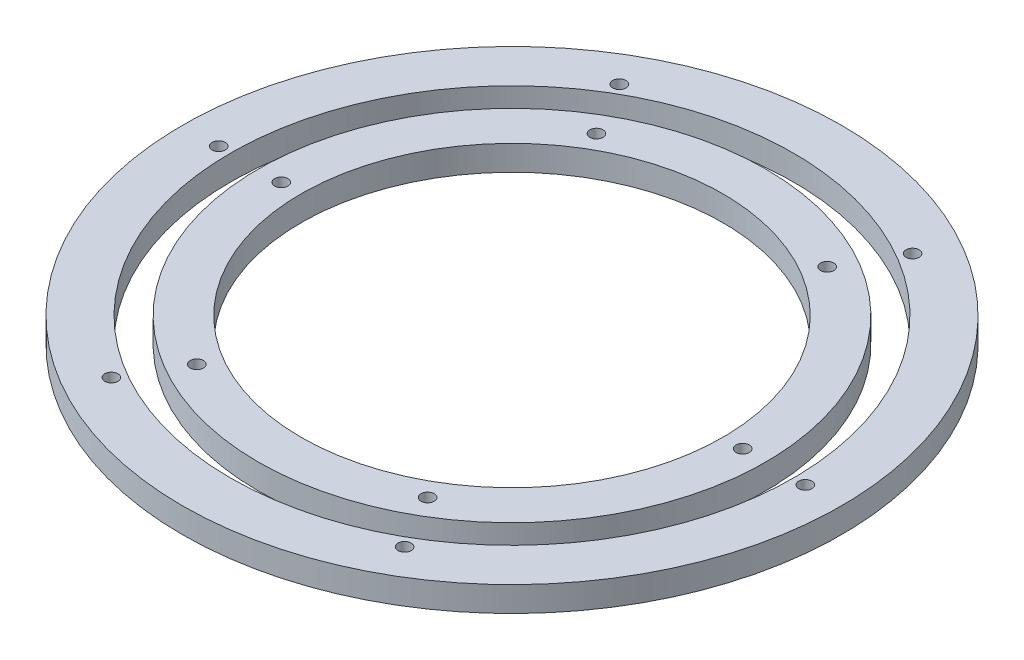
ISO-10303-21;
HEADER;
FILE_DESCRIPTION(('STEP AP214'),'2;1');
FILE_NAME('part.step','',(''),(''),'','','');
FILE_SCHEMA(('AUTOMOTIVE_DESIGN { 1 0 10303 214 1 1 1 1 }'));
ENDSEC;
DATA;
#1=APPLICATION_CONTEXT('core data for automotive mechanical design processes');
#2=APPLICATION_PROTOCOL_DEFINITION('international standard','automotive_design',2000,#1);
#3=PRODUCT_CONTEXT('',#1,'mechanical');
#4=PRODUCT('Part','Part','',(#3));
#5=PRODUCT_RELATED_PRODUCT_CATEGORY('part','',(#4));
#6=PRODUCT_DEFINITION_FORMATION('','',#4);
#7=PRODUCT_DEFINITION_CONTEXT('part definition',#1,'design');
#8=PRODUCT_DEFINITION('design','',#6,#7);
#9=PRODUCT_DEFINITION_SHAPE('','',#8);
#10=(LENGTH_UNIT() NAMED_UNIT(*) SI_UNIT(.MILLI.,.METRE.));
#11=(NAMED_UNIT(*) PLANE_ANGLE_UNIT() SI_UNIT($,.RADIAN.));
#12=(NAMED_UNIT(*) SI_UNIT($,.STERADIAN.) SOLID_ANGLE_UNIT());
#13=UNCERTAINTY_MEASURE_WITH_UNIT(LENGTH_MEASURE(1.E-05),#10,'distance_accuracy_value','');
#14=(GEOMETRIC_REPRESENTATION_CONTEXT(3) GLOBAL_UNCERTAINTY_ASSIGNED_CONTEXT((#13)) GLOBAL_UNIT_ASSIGNED_CONTEXT((#10,
#11,#12)) REPRESENTATION_CONTEXT('',''));
#15=CARTESIAN_POINT('',(0.,0.,0.));
#16=DIRECTION('',(0.,0.,1.));
#17=DIRECTION('',(1.,0.,0.));
#18=AXIS2_PLACEMENT_3D('',#15,#16,#17);
#19=CARTESIAN_POINT('',(0.,9.5,0.));
#20=DIRECTION('',(0.,1.,0.));
#21=DIRECTION('',(0.,0.,1.));
#22=AXIS2_PLACEMENT_3D('',#19,#20,#21);
#23=PLANE('',#22);
#24=CARTESIAN_POINT('',(-111.25,9.5,192.690652342038));
#25=DIRECTION('',(0.,1.,0.));
#26=DIRECTION('',(0.,0.,1.));
#27=AXIS2_PLACEMENT_3D('',#24,#25,#26);
#28=CIRCLE('',#27,4.99999999999988);
#29=CARTESIAN_POINT('',(-111.25,9.5,197.690652342037));
#30=VERTEX_POINT('',#29);
#31=EDGE_CURVE('E11',#30,#30,#28,.T.);
#32=ORIENTED_EDGE('',*,*,#31,.F.);
#33=EDGE_LOOP('',(#32));
#34=FACE_BOUND('',#33,.T.);
#35=CARTESIAN_POINT('',(111.25,9.5,192.690652342038));
#36=DIRECTION('',(0.,1.,0.));
#37=DIRECTION('',(0.,0.,-1.));
#38=AXIS2_PLACEMENT_3D('',#35,#36,#37);
#39=CIRCLE('',#38,5.00000000000039);
#40=CARTESIAN_POINT('',(111.25,9.5,187.690652342038));
#41=VERTEX_POINT('',#40);
#42=EDGE_CURVE('E54',#41,#41,#39,.T.);
#43=ORIENTED_EDGE('',*,*,#42,.F.);
#44=EDGE_LOOP('',(#43));
#45=FACE_BOUND('',#44,.T.);
#46=CARTESIAN_POINT('',(-111.25,9.5,-192.690652342038));
#47=DIRECTION('',(0.,1.,0.));
#48=DIRECTION('',(0.,0.,-1.));
#49=AXIS2_PLACEMENT_3D('',#46,#47,#48);
#50=CIRCLE('',#49,4.99999999999988);
#51=CARTESIAN_POINT('',(-111.25,9.5,-197.690652342037));
#52=VERTEX_POINT('',#51);
#53=EDGE_CURVE('E60',#52,#52,#50,.T.);
#54=ORIENTED_EDGE('',*,*,#53,.F.);
#55=EDGE_LOOP('',(#54));
#56=FACE_BOUND('',#55,.T.);
#57=CARTESIAN_POINT('',(-222.5,9.5,0.));
#58=DIRECTION('',(0.,1.,0.));
#59=DIRECTION('',(0.,0.,-1.));
#60=AXIS2_PLACEMENT_3D('',#57,#58,#59);
#61=CIRCLE('',#60,4.99999999999999);
#62=CARTESIAN_POINT('',(-222.5,9.5,-4.99999999999999));
#63=VERTEX_POINT('',#62);
#64=EDGE_CURVE('E79',#63,#63,#61,.T.);
#65=ORIENTED_EDGE('',*,*,#64,.F.);
#66=EDGE_LOOP('',(#65));
#67=FACE_BOUND('',#66,.T.);
#68=CARTESIAN_POINT('',(222.5,9.5,0.));
#69=DIRECTION('',(0.,1.,0.));
#70=DIRECTION('',(0.,0.,1.));
#71=AXIS2_PLACEMENT_3D('',#68,#69,#70);
#72=CIRCLE('',#71,4.99999999999999);
#73=CARTESIAN_POINT('',(222.5,9.5,4.99999999999999));
#74=VERTEX_POINT('',#73);
#75=EDGE_CURVE('E87',#74,#74,#72,.T.);
#76=ORIENTED_EDGE('',*,*,#75,.F.);
#77=EDGE_LOOP('',(#76));
#78=FACE_BOUND('',#77,.T.);
#79=CARTESIAN_POINT('',(111.249999999999,9.5,-192.690652342038));
#80=DIRECTION('',(0.,1.,0.));
#81=DIRECTION('',(0.,0.,1.));
#82=AXIS2_PLACEMENT_3D('',#79,#80,#81);
#83=CIRCLE('',#82,5.00000000000042);
#84=CARTESIAN_POINT('',(111.249999999999,9.5,-187.690652342038));
#85=VERTEX_POINT('',#84);
#86=EDGE_CURVE('E95',#85,#85,#83,.T.);
#87=ORIENTED_EDGE('',*,*,#86,.F.);
#88=EDGE_LOOP('',(#87));
#89=FACE_BOUND('',#88,.T.);
#90=CARTESIAN_POINT('',(0.,9.5,0.));
#91=DIRECTION('',(0.,1.,0.));
#92=DIRECTION('',(0.,0.,1.));
#93=AXIS2_PLACEMENT_3D('',#90,#91,#92);
#94=CIRCLE('',#93,213.5);
#95=CARTESIAN_POINT('',(0.,9.5,213.5));
#96=VERTEX_POINT('',#95);
#97=EDGE_CURVE('E100',#96,#96,#94,.T.);
#98=ORIENTED_EDGE('',*,*,#97,.F.);
#99=EDGE_LOOP('',(#98));
#100=FACE_BOUND('',#99,.T.);
#101=CARTESIAN_POINT('',(0.,9.5,0.));
#102=DIRECTION('',(0.,1.,0.));
#103=DIRECTION('',(0.,0.,1.));
#104=AXIS2_PLACEMENT_3D('',#101,#102,#103);
#105=CIRCLE('',#104,250.);
#106=CARTESIAN_POINT('',(0.,9.5,250.));
#107=VERTEX_POINT('',#106);
#108=EDGE_CURVE('E70',#107,#107,#105,.T.);
#109=ORIENTED_EDGE('',*,*,#108,.T.);
#110=EDGE_LOOP('',(#109));
#111=FACE_BOUND('',#110,.T.);
#112=ADVANCED_FACE('F45',(#34,#45,#56,#67,#78,#89,#100,#111),#23,.T.);
#113=CARTESIAN_POINT('',(0.,-9.5,0.));
#114=DIRECTION('',(0.,1.,0.));
#115=DIRECTION('',(0.,0.,1.));
#116=AXIS2_PLACEMENT_3D('',#113,#114,#115);
#117=PLANE('',#116);
#118=CARTESIAN_POINT('',(-111.25,-9.5,192.690652342038));
#119=DIRECTION('',(0.,1.,0.));
#120=DIRECTION('',(0.,0.,1.));
#121=AXIS2_PLACEMENT_3D('',#118,#119,#120);
#122=CIRCLE('',#121,4.99999999999988);
#123=CARTESIAN_POINT('',(-111.25,-9.5,197.690652342037));
#124=VERTEX_POINT('',#123);
#125=EDGE_CURVE('E66',#124,#124,#122,.T.);
#126=ORIENTED_EDGE('',*,*,#125,.T.);
#127=EDGE_LOOP('',(#126));
#128=FACE_BOUND('',#127,.T.);
#129=CARTESIAN_POINT('',(111.25,-9.5,192.690652342038));
#130=DIRECTION('',(0.,1.,0.));
#131=DIRECTION('',(0.,0.,-1.));
#132=AXIS2_PLACEMENT_3D('',#129,#130,#131);
#133=CIRCLE('',#132,5.00000000000039);
#134=CARTESIAN_POINT('',(111.25,-9.5,187.690652342038));
#135=VERTEX_POINT('',#134);
#136=EDGE_CURVE('E69',#135,#135,#133,.T.);
#137=ORIENTED_EDGE('',*,*,#136,.T.);
#138=EDGE_LOOP('',(#137));
#139=FACE_BOUND('',#138,.T.);
#140=CARTESIAN_POINT('',(-111.25,-9.5,-192.690652342038));
#141=DIRECTION('',(0.,1.,0.));
#142=DIRECTION('',(0.,0.,-1.));
#143=AXIS2_PLACEMENT_3D('',#140,#141,#142);
#144=CIRCLE('',#143,4.99999999999988);
#145=CARTESIAN_POINT('',(-111.25,-9.5,-197.690652342037));
#146=VERTEX_POINT('',#145);
#147=EDGE_CURVE('E75',#146,#146,#144,.T.);
#148=ORIENTED_EDGE('',*,*,#147,.T.);
#149=EDGE_LOOP('',(#148));
#150=FACE_BOUND('',#149,.T.);
#151=CARTESIAN_POINT('',(-222.5,-9.5,0.));
#152=DIRECTION('',(0.,1.,0.));
#153=DIRECTION('',(0.,0.,-1.));
#154=AXIS2_PLACEMENT_3D('',#151,#152,#153);
#155=CIRCLE('',#154,4.99999999999999);
#156=CARTESIAN_POINT('',(-222.5,-9.5,-4.99999999999999));
#157=VERTEX_POINT('',#156);
#158=EDGE_CURVE('E83',#157,#157,#155,.T.);
#159=ORIENTED_EDGE('',*,*,#158,.T.);
#160=EDGE_LOOP('',(#159));
#161=FACE_BOUND('',#160,.T.);
#162=CARTESIAN_POINT('',(222.5,-9.5,0.));
#163=DIRECTION('',(0.,1.,0.));
#164=DIRECTION('',(0.,0.,1.));
#165=AXIS2_PLACEMENT_3D('',#162,#163,#164);
#166=CIRCLE('',#165,4.99999999999999);
#167=CARTESIAN_POINT('',(222.5,-9.5,4.99999999999999));
#168=VERTEX_POINT('',#167);
#169=EDGE_CURVE('E91',#168,#168,#166,.T.);
#170=ORIENTED_EDGE('',*,*,#169,.T.);
#171=EDGE_LOOP('',(#170));
#172=FACE_BOUND('',#171,.T.);
#173=CARTESIAN_POINT('',(111.249999999999,-9.5,-192.690652342038));
#174=DIRECTION('',(0.,1.,0.));
#175=DIRECTION('',(0.,0.,1.));
#176=AXIS2_PLACEMENT_3D('',#173,#174,#175);
#177=CIRCLE('',#176,5.00000000000042);
#178=CARTESIAN_POINT('',(111.249999999999,-9.5,-187.690652342038));
#179=VERTEX_POINT('',#178);
#180=EDGE_CURVE('E49',#179,#179,#177,.T.);
#181=ORIENTED_EDGE('',*,*,#180,.T.);
#182=EDGE_LOOP('',(#181));
#183=FACE_BOUND('',#182,.T.);
#184=CARTESIAN_POINT('',(0.,-9.5,0.));
#185=DIRECTION('',(0.,1.,0.));
#186=DIRECTION('',(0.,0.,1.));
#187=AXIS2_PLACEMENT_3D('',#184,#185,#186);
#188=CIRCLE('',#187,213.5);
#189=CARTESIAN_POINT('',(0.,-9.5,213.5));
#190=VERTEX_POINT('',#189);
#191=EDGE_CURVE('E64',#190,#190,#188,.T.);
#192=ORIENTED_EDGE('',*,*,#191,.T.);
#193=EDGE_LOOP('',(#192));
#194=FACE_BOUND('',#193,.T.);
#195=CARTESIAN_POINT('',(0.,-9.5,0.));
#196=DIRECTION('',(0.,1.,0.));
#197=DIRECTION('',(0.,0.,1.));
#198=AXIS2_PLACEMENT_3D('',#195,#196,#197);
#199=CIRCLE('',#198,250.);
#200=CARTESIAN_POINT('',(0.,-9.5,250.));
#201=VERTEX_POINT('',#200);
#202=EDGE_CURVE('E105',#201,#201,#199,.T.);
#203=ORIENTED_EDGE('',*,*,#202,.F.);
#204=EDGE_LOOP('',(#203));
#205=FACE_BOUND('',#204,.T.);
#206=ADVANCED_FACE('F47',(#128,#139,#150,#161,#172,#183,#194,#205),#117,.F.);
#207=CARTESIAN_POINT('',(0.,9.5,0.));
#208=DIRECTION('',(0.,-1.,0.));
#209=DIRECTION('',(0.,0.,-1.));
#210=AXIS2_PLACEMENT_3D('',#207,#208,#209);
#211=CYLINDRICAL_SURFACE('',#210,250.);
#212=ORIENTED_EDGE('',*,*,#108,.F.);
#213=EDGE_LOOP('',(#212));
#214=FACE_BOUND('',#213,.T.);
#215=ORIENTED_EDGE('',*,*,#202,.T.);
#216=EDGE_LOOP('',(#215));
#217=FACE_BOUND('',#216,.T.);
#218=ADVANCED_FACE('F117',(#214,#217),#211,.T.);
#219=CARTESIAN_POINT('',(0.,-9.5,0.));
#220=DIRECTION('',(0.,1.,0.));
#221=DIRECTION('',(0.,0.,1.));
#222=AXIS2_PLACEMENT_3D('',#219,#220,#221);
#223=CYLINDRICAL_SURFACE('',#222,213.5);
#224=ORIENTED_EDGE('',*,*,#191,.F.);
#225=EDGE_LOOP('',(#224));
#226=FACE_BOUND('',#225,.T.);
#227=ORIENTED_EDGE('',*,*,#97,.T.);
#228=EDGE_LOOP('',(#227));
#229=FACE_BOUND('',#228,.T.);
#230=ADVANCED_FACE('F120',(#226,#229),#223,.F.);
#231=CARTESIAN_POINT('',(111.249999999999,-9.5,-192.690652342038));
#232=DIRECTION('',(0.,1.,0.));
#233=DIRECTION('',(0.,0.,1.));
#234=AXIS2_PLACEMENT_3D('',#231,#232,#233);
#235=CYLINDRICAL_SURFACE('',#234,5.00000000000042);
#236=ORIENTED_EDGE('',*,*,#180,.F.);
#237=EDGE_LOOP('',(#236));
#238=FACE_BOUND('',#237,.T.);
#239=ORIENTED_EDGE('',*,*,#86,.T.);
#240=EDGE_LOOP('',(#239));
#241=FACE_BOUND('',#240,.T.);
#242=ADVANCED_FACE('F149',(#238,#241),#235,.F.);
#243=CARTESIAN_POINT('',(222.5,-9.5,0.));
#244=DIRECTION('',(0.,1.,0.));
#245=DIRECTION('',(0.,0.,1.));
#246=AXIS2_PLACEMENT_3D('',#243,#244,#245);
#247=CYLINDRICAL_SURFACE('',#246,4.99999999999999);
#248=ORIENTED_EDGE('',*,*,#169,.F.);
#249=EDGE_LOOP('',(#248));
#250=FACE_BOUND('',#249,.T.);
#251=ORIENTED_EDGE('',*,*,#75,.T.);
#252=EDGE_LOOP('',(#251));
#253=FACE_BOUND('',#252,.T.);
#254=ADVANCED_FACE('F154',(#250,#253),#247,.F.);
#255=CARTESIAN_POINT('',(-222.5,-9.5,0.));
#256=DIRECTION('',(0.,1.,0.));
#257=DIRECTION('',(0.,0.,1.));
#258=AXIS2_PLACEMENT_3D('',#255,#256,#257);
#259=CYLINDRICAL_SURFACE('',#258,4.99999999999999);
#260=ORIENTED_EDGE('',*,*,#158,.F.);
#261=EDGE_LOOP('',(#260));
#262=FACE_BOUND('',#261,.T.);
#263=ORIENTED_EDGE('',*,*,#64,.T.);
#264=EDGE_LOOP('',(#263));
#265=FACE_BOUND('',#264,.T.);
#266=ADVANCED_FACE('F169',(#262,#265),#259,.F.);
#267=CARTESIAN_POINT('',(-111.25,-9.5,-192.690652342038));
#268=DIRECTION('',(0.,1.,0.));
#269=DIRECTION('',(0.,0.,1.));
#270=AXIS2_PLACEMENT_3D('',#267,#268,#269);
#271=CYLINDRICAL_SURFACE('',#270,4.99999999999988);
#272=ORIENTED_EDGE('',*,*,#147,.F.);
#273=EDGE_LOOP('',(#272));
#274=FACE_BOUND('',#273,.T.);
#275=ORIENTED_EDGE('',*,*,#53,.T.);
#276=EDGE_LOOP('',(#275));
#277=FACE_BOUND('',#276,.T.);
#278=ADVANCED_FACE('F165',(#274,#277),#271,.F.);
#279=CARTESIAN_POINT('',(111.25,-9.5,192.690652342038));
#280=DIRECTION('',(0.,1.,0.));
#281=DIRECTION('',(0.,0.,1.));
#282=AXIS2_PLACEMENT_3D('',#279,#280,#281);
#283=CYLINDRICAL_SURFACE('',#282,5.00000000000039);
#284=ORIENTED_EDGE('',*,*,#136,.F.);
#285=EDGE_LOOP('',(#284));
#286=FACE_BOUND('',#285,.T.);
#287=ORIENTED_EDGE('',*,*,#42,.T.);
#288=EDGE_LOOP('',(#287));
#289=FACE_BOUND('',#288,.T.);
#290=ADVANCED_FACE('F161',(#286,#289),#283,.F.);
#291=CARTESIAN_POINT('',(-111.25,-9.5,192.690652342038));
#292=DIRECTION('',(0.,1.,0.));
#293=DIRECTION('',(0.,0.,1.));
#294=AXIS2_PLACEMENT_3D('',#291,#292,#293);
#295=CYLINDRICAL_SURFACE('',#294,4.99999999999988);
#296=ORIENTED_EDGE('',*,*,#125,.F.);
#297=EDGE_LOOP('',(#296));
#298=FACE_BOUND('',#297,.T.);
#299=ORIENTED_EDGE('',*,*,#31,.T.);
#300=EDGE_LOOP('',(#299));
#301=FACE_BOUND('',#300,.T.);
#302=ADVANCED_FACE('F158',(#298,#301),#295,.F.);
#303=CLOSED_SHELL('',(#112,#206,#218,#230,#242,#254,#266,#278,#290,#302));
#304=MANIFOLD_SOLID_BREP('B2',#303);
#305=CARTESIAN_POINT('',(0.,9.5,0.));
#306=DIRECTION('',(0.,1.,0.));
#307=DIRECTION('',(0.,0.,1.));
#308=AXIS2_PLACEMENT_3D('',#305,#306,#307);
#309=PLANE('',#308);
#310=CARTESIAN_POINT('',(-87.5,9.5,-151.554445662277));
#311=DIRECTION('',(0.,1.,0.));
#312=DIRECTION('',(0.,0.,1.));
#313=AXIS2_PLACEMENT_3D('',#310,#311,#312);
#314=CIRCLE('',#313,5.00000000000001);
#315=CARTESIAN_POINT('',(-87.5,9.5,-146.554445662277));
#316=VERTEX_POINT('',#315);
#317=EDGE_CURVE('E298',#316,#316,#314,.T.);
#318=ORIENTED_EDGE('',*,*,#317,.F.);
#319=EDGE_LOOP('',(#318));
#320=FACE_BOUND('',#319,.T.);
#321=CARTESIAN_POINT('',(-175.,9.5,0.));
#322=DIRECTION('',(0.,1.,0.));
#323=DIRECTION('',(0.,0.,1.));
#324=AXIS2_PLACEMENT_3D('',#321,#322,#323);
#325=CIRCLE('',#324,4.99999999999999);
#326=CARTESIAN_POINT('',(-175.,9.5,4.99999999999999));
#327=VERTEX_POINT('',#326);
#328=EDGE_CURVE('E292',#327,#327,#325,.T.);
#329=ORIENTED_EDGE('',*,*,#328,.F.);
#330=EDGE_LOOP('',(#329));
#331=FACE_BOUND('',#330,.T.);
#332=CARTESIAN_POINT('',(175.,9.5,-1.33226762955019E-12));
#333=DIRECTION('',(0.,1.,0.));
#334=DIRECTION('',(0.,0.,-1.));
#335=AXIS2_PLACEMENT_3D('',#332,#333,#334);
#336=CIRCLE('',#335,4.99999999999999);
#337=CARTESIAN_POINT('',(175.,9.5,-5.00000000000132));
#338=VERTEX_POINT('',#337);
#339=EDGE_CURVE('E286',#338,#338,#336,.T.);
#340=ORIENTED_EDGE('',*,*,#339,.F.);
#341=EDGE_LOOP('',(#340));
#342=FACE_BOUND('',#341,.T.);
#343=CARTESIAN_POINT('',(87.4999999999989,9.5,-151.554445662277));
#344=DIRECTION('',(0.,1.,0.));
#345=DIRECTION('',(0.,0.,-1.));
#346=AXIS2_PLACEMENT_3D('',#343,#344,#345);
#347=CIRCLE('',#346,5.00000000000001);
#348=CARTESIAN_POINT('',(87.4999999999989,9.5,-156.554445662277));
#349=VERTEX_POINT('',#348);
#350=EDGE_CURVE('E280',#349,#349,#347,.T.);
#351=ORIENTED_EDGE('',*,*,#350,.F.);
#352=EDGE_LOOP('',(#351));
#353=FACE_BOUND('',#352,.T.);
#354=CARTESIAN_POINT('',(87.4999999999989,9.5,151.554445662277));
#355=DIRECTION('',(0.,1.,0.));
#356=DIRECTION('',(0.,0.,1.));
#357=AXIS2_PLACEMENT_3D('',#354,#355,#356);
#358=CIRCLE('',#357,5.00000000000001);
#359=CARTESIAN_POINT('',(87.4999999999989,9.5,156.554445662277));
#360=VERTEX_POINT('',#359);
#361=EDGE_CURVE('E274',#360,#360,#358,.T.);
#362=ORIENTED_EDGE('',*,*,#361,.F.);
#363=EDGE_LOOP('',(#362));
#364=FACE_BOUND('',#363,.T.);
#365=CARTESIAN_POINT('',(-87.5,9.5,151.554445662277));
#366=DIRECTION('',(0.,1.,0.));
#367=DIRECTION('',(0.,0.,-1.));
#368=AXIS2_PLACEMENT_3D('',#365,#366,#367);
#369=CIRCLE('',#368,5.00000000000001);
#370=CARTESIAN_POINT('',(-87.5,9.5,146.554445662277));
#371=VERTEX_POINT('',#370);
#372=EDGE_CURVE('E268',#371,#371,#369,.T.);
#373=ORIENTED_EDGE('',*,*,#372,.F.);
#374=EDGE_LOOP('',(#373));
#375=FACE_BOUND('',#374,.T.);
#376=CARTESIAN_POINT('',(0.,9.5,0.));
#377=DIRECTION('',(0.,1.,0.));
#378=DIRECTION('',(0.,0.,1.));
#379=AXIS2_PLACEMENT_3D('',#376,#377,#378);
#380=CIRCLE('',#379,160.);
#381=CARTESIAN_POINT('',(0.,9.5,160.));
#382=VERTEX_POINT('',#381);
#383=EDGE_CURVE('E44',#382,#382,#380,.T.);
#384=ORIENTED_EDGE('',*,*,#383,.F.);
#385=EDGE_LOOP('',(#384));
#386=FACE_BOUND('',#385,.T.);
#387=CARTESIAN_POINT('',(0.,9.5,0.));
#388=DIRECTION('',(0.,1.,0.));
#389=DIRECTION('',(0.,0.,1.));
#390=AXIS2_PLACEMENT_3D('',#387,#388,#389);
#391=CIRCLE('',#390,192.5);
#392=CARTESIAN_POINT('',(0.,9.5,192.5));
#393=VERTEX_POINT('',#392);
#394=EDGE_CURVE('E262',#393,#393,#391,.T.);
#395=ORIENTED_EDGE('',*,*,#394,.T.);
#396=EDGE_LOOP('',(#395));
#397=FACE_BOUND('',#396,.T.);
#398=ADVANCED_FACE('F249',(#320,#331,#342,#353,#364,#375,#386,#397),#309,.T.);
#399=CARTESIAN_POINT('',(0.,9.5,0.));
#400=DIRECTION('',(0.,-1.,0.));
#401=DIRECTION('',(0.,0.,-1.));
#402=AXIS2_PLACEMENT_3D('',#399,#400,#401);
#403=CYLINDRICAL_SURFACE('',#402,160.);
#404=ORIENTED_EDGE('',*,*,#383,.T.);
#405=EDGE_LOOP('',(#404));
#406=FACE_BOUND('',#405,.T.);
#407=CARTESIAN_POINT('',(0.,-9.5,0.));
#408=DIRECTION('',(0.,1.,0.));
#409=DIRECTION('',(0.,0.,1.));
#410=AXIS2_PLACEMENT_3D('',#407,#408,#409);
#411=CIRCLE('',#410,160.);
#412=CARTESIAN_POINT('',(0.,-9.5,160.));
#413=VERTEX_POINT('',#412);
#414=EDGE_CURVE('E253',#413,#413,#411,.T.);
#415=ORIENTED_EDGE('',*,*,#414,.F.);
#416=EDGE_LOOP('',(#415));
#417=FACE_BOUND('',#416,.T.);
#418=ADVANCED_FACE('F315',(#406,#417),#403,.F.);
#419=CARTESIAN_POINT('',(0.,-9.5,0.));
#420=DIRECTION('',(0.,1.,0.));
#421=DIRECTION('',(0.,0.,1.));
#422=AXIS2_PLACEMENT_3D('',#419,#420,#421);
#423=PLANE('',#422);
#424=CARTESIAN_POINT('',(-87.5,-9.5,-151.554445662277));
#425=DIRECTION('',(0.,1.,0.));
#426=DIRECTION('',(0.,0.,1.));
#427=AXIS2_PLACEMENT_3D('',#424,#425,#426);
#428=CIRCLE('',#427,5.00000000000001);
#429=CARTESIAN_POINT('',(-87.5,-9.5,-146.554445662277));
#430=VERTEX_POINT('',#429);
#431=EDGE_CURVE('E265',#430,#430,#428,.T.);
#432=ORIENTED_EDGE('',*,*,#431,.T.);
#433=EDGE_LOOP('',(#432));
#434=FACE_BOUND('',#433,.T.);
#435=CARTESIAN_POINT('',(-175.,-9.5,0.));
#436=DIRECTION('',(0.,1.,0.));
#437=DIRECTION('',(0.,0.,1.));
#438=AXIS2_PLACEMENT_3D('',#435,#436,#437);
#439=CIRCLE('',#438,4.99999999999999);
#440=CARTESIAN_POINT('',(-175.,-9.5,4.99999999999999));
#441=VERTEX_POINT('',#440);
#442=EDGE_CURVE('E295',#441,#441,#439,.T.);
#443=ORIENTED_EDGE('',*,*,#442,.T.);
#444=EDGE_LOOP('',(#443));
#445=FACE_BOUND('',#444,.T.);
#446=CARTESIAN_POINT('',(175.,-9.5,-1.33226762955019E-12));
#447=DIRECTION('',(0.,1.,0.));
#448=DIRECTION('',(0.,0.,-1.));
#449=AXIS2_PLACEMENT_3D('',#446,#447,#448);
#450=CIRCLE('',#449,4.99999999999999);
#451=CARTESIAN_POINT('',(175.,-9.5,-5.00000000000132));
#452=VERTEX_POINT('',#451);
#453=EDGE_CURVE('E289',#452,#452,#450,.T.);
#454=ORIENTED_EDGE('',*,*,#453,.T.);
#455=EDGE_LOOP('',(#454));
#456=FACE_BOUND('',#455,.T.);
#457=CARTESIAN_POINT('',(87.4999999999989,-9.5,-151.554445662277));
#458=DIRECTION('',(0.,1.,0.));
#459=DIRECTION('',(0.,0.,-1.));
#460=AXIS2_PLACEMENT_3D('',#457,#458,#459);
#461=CIRCLE('',#460,5.00000000000001);
#462=CARTESIAN_POINT('',(87.4999999999989,-9.5,-156.554445662277));
#463=VERTEX_POINT('',#462);
#464=EDGE_CURVE('E283',#463,#463,#461,.T.);
#465=ORIENTED_EDGE('',*,*,#464,.T.);
#466=EDGE_LOOP('',(#465));
#467=FACE_BOUND('',#466,.T.);
#468=CARTESIAN_POINT('',(87.4999999999989,-9.5,151.554445662277));
#469=DIRECTION('',(0.,1.,0.));
#470=DIRECTION('',(0.,0.,1.));
#471=AXIS2_PLACEMENT_3D('',#468,#469,#470);
#472=CIRCLE('',#471,5.00000000000001);
#473=CARTESIAN_POINT('',(87.4999999999989,-9.5,156.554445662277));
#474=VERTEX_POINT('',#473);
#475=EDGE_CURVE('E277',#474,#474,#472,.T.);
#476=ORIENTED_EDGE('',*,*,#475,.T.);
#477=EDGE_LOOP('',(#476));
#478=FACE_BOUND('',#477,.T.);
#479=CARTESIAN_POINT('',(-87.5,-9.5,151.554445662277));
#480=DIRECTION('',(0.,1.,0.));
#481=DIRECTION('',(0.,0.,-1.));
#482=AXIS2_PLACEMENT_3D('',#479,#480,#481);
#483=CIRCLE('',#482,5.00000000000001);
#484=CARTESIAN_POINT('',(-87.5,-9.5,146.554445662277));
#485=VERTEX_POINT('',#484);
#486=EDGE_CURVE('E271',#485,#485,#483,.T.);
#487=ORIENTED_EDGE('',*,*,#486,.T.);
#488=EDGE_LOOP('',(#487));
#489=FACE_BOUND('',#488,.T.);
#490=ORIENTED_EDGE('',*,*,#414,.T.);
#491=EDGE_LOOP('',(#490));
#492=FACE_BOUND('',#491,.T.);
#493=CARTESIAN_POINT('',(0.,-9.5,0.));
#494=DIRECTION('',(0.,1.,0.));
#495=DIRECTION('',(0.,0.,1.));
#496=AXIS2_PLACEMENT_3D('',#493,#494,#495);
#497=CIRCLE('',#496,192.5);
#498=CARTESIAN_POINT('',(0.,-9.5,192.5));
#499=VERTEX_POINT('',#498);
#500=EDGE_CURVE('E260',#499,#499,#497,.T.);
#501=ORIENTED_EDGE('',*,*,#500,.F.);
#502=EDGE_LOOP('',(#501));
#503=FACE_BOUND('',#502,.T.);
#504=ADVANCED_FACE('F251',(#434,#445,#456,#467,#478,#489,#492,#503),#423,.F.);
#505=CARTESIAN_POINT('',(0.,-9.5,0.));
#506=DIRECTION('',(0.,1.,0.));
#507=DIRECTION('',(0.,0.,1.));
#508=AXIS2_PLACEMENT_3D('',#505,#506,#507);
#509=CYLINDRICAL_SURFACE('',#508,192.5);
#510=ORIENTED_EDGE('',*,*,#500,.T.);
#511=EDGE_LOOP('',(#510));
#512=FACE_BOUND('',#511,.T.);
#513=ORIENTED_EDGE('',*,*,#394,.F.);
#514=EDGE_LOOP('',(#513));
#515=FACE_BOUND('',#514,.T.);
#516=ADVANCED_FACE('F329',(#512,#515),#509,.T.);
#517=CARTESIAN_POINT('',(-87.5,-9.5,151.554445662277));
#518=DIRECTION('',(0.,1.,0.));
#519=DIRECTION('',(0.,0.,1.));
#520=AXIS2_PLACEMENT_3D('',#517,#518,#519);
#521=CYLINDRICAL_SURFACE('',#520,5.00000000000001);
#522=ORIENTED_EDGE('',*,*,#486,.F.);
#523=EDGE_LOOP('',(#522));
#524=FACE_BOUND('',#523,.T.);
#525=ORIENTED_EDGE('',*,*,#372,.T.);
#526=EDGE_LOOP('',(#525));
#527=FACE_BOUND('',#526,.T.);
#528=ADVANCED_FACE('F331',(#524,#527),#521,.F.);
#529=CARTESIAN_POINT('',(87.4999999999989,-9.5,151.554445662277));
#530=DIRECTION('',(0.,1.,0.));
#531=DIRECTION('',(0.,0.,1.));
#532=AXIS2_PLACEMENT_3D('',#529,#530,#531);
#533=CYLINDRICAL_SURFACE('',#532,5.00000000000001);
#534=ORIENTED_EDGE('',*,*,#475,.F.);
#535=EDGE_LOOP('',(#534));
#536=FACE_BOUND('',#535,.T.);
#537=ORIENTED_EDGE('',*,*,#361,.T.);
#538=EDGE_LOOP('',(#537));
#539=FACE_BOUND('',#538,.T.);
#540=ADVANCED_FACE('F338',(#536,#539),#533,.F.);
#541=CARTESIAN_POINT('',(87.4999999999989,-9.5,-151.554445662277));
#542=DIRECTION('',(0.,1.,0.));
#543=DIRECTION('',(0.,0.,1.));
#544=AXIS2_PLACEMENT_3D('',#541,#542,#543);
#545=CYLINDRICAL_SURFACE('',#544,5.00000000000001);
#546=ORIENTED_EDGE('',*,*,#464,.F.);
#547=EDGE_LOOP('',(#546));
#548=FACE_BOUND('',#547,.T.);
#549=ORIENTED_EDGE('',*,*,#350,.T.);
#550=EDGE_LOOP('',(#549));
#551=FACE_BOUND('',#550,.T.);
#552=ADVANCED_FACE('F375',(#548,#551),#545,.F.);
#553=CARTESIAN_POINT('',(175.,-9.5,-1.33226762955019E-12));
#554=DIRECTION('',(0.,1.,0.));
#555=DIRECTION('',(0.,0.,1.));
#556=AXIS2_PLACEMENT_3D('',#553,#554,#555);
#557=CYLINDRICAL_SURFACE('',#556,4.99999999999999);
#558=ORIENTED_EDGE('',*,*,#453,.F.);
#559=EDGE_LOOP('',(#558));
#560=FACE_BOUND('',#559,.T.);
#561=ORIENTED_EDGE('',*,*,#339,.T.);
#562=EDGE_LOOP('',(#561));
#563=FACE_BOUND('',#562,.T.);
#564=ADVANCED_FACE('F384',(#560,#563),#557,.F.);
#565=CARTESIAN_POINT('',(-175.,-9.5,0.));
#566=DIRECTION('',(0.,1.,0.));
#567=DIRECTION('',(0.,0.,1.));
#568=AXIS2_PLACEMENT_3D('',#565,#566,#567);
#569=CYLINDRICAL_SURFACE('',#568,4.99999999999999);
#570=ORIENTED_EDGE('',*,*,#442,.F.);
#571=EDGE_LOOP('',(#570));
#572=FACE_BOUND('',#571,.T.);
#573=ORIENTED_EDGE('',*,*,#328,.T.);
#574=EDGE_LOOP('',(#573));
#575=FACE_BOUND('',#574,.T.);
#576=ADVANCED_FACE('F309',(#572,#575),#569,.F.);
#577=CARTESIAN_POINT('',(-87.5,-9.5,-151.554445662277));
#578=DIRECTION('',(0.,1.,0.));
#579=DIRECTION('',(0.,0.,1.));
#580=AXIS2_PLACEMENT_3D('',#577,#578,#579);
#581=CYLINDRICAL_SURFACE('',#580,5.00000000000001);
#582=ORIENTED_EDGE('',*,*,#431,.F.);
#583=EDGE_LOOP('',(#582));
#584=FACE_BOUND('',#583,.T.);
#585=ORIENTED_EDGE('',*,*,#317,.T.);
#586=EDGE_LOOP('',(#585));
#587=FACE_BOUND('',#586,.T.);
#588=ADVANCED_FACE('F306',(#584,#587),#581,.F.);
#589=CLOSED_SHELL('',(#398,#418,#504,#516,#528,#540,#552,#564,#576,#588));
#590=MANIFOLD_SOLID_BREP('B6',#589);
#591=ADVANCED_BREP_SHAPE_REPRESENTATION('',(#18,#304,#590),#14);
#592=SHAPE_DEFINITION_REPRESENTATION(#9,#591);
ENDSEC;
END-ISO-10303-21;
